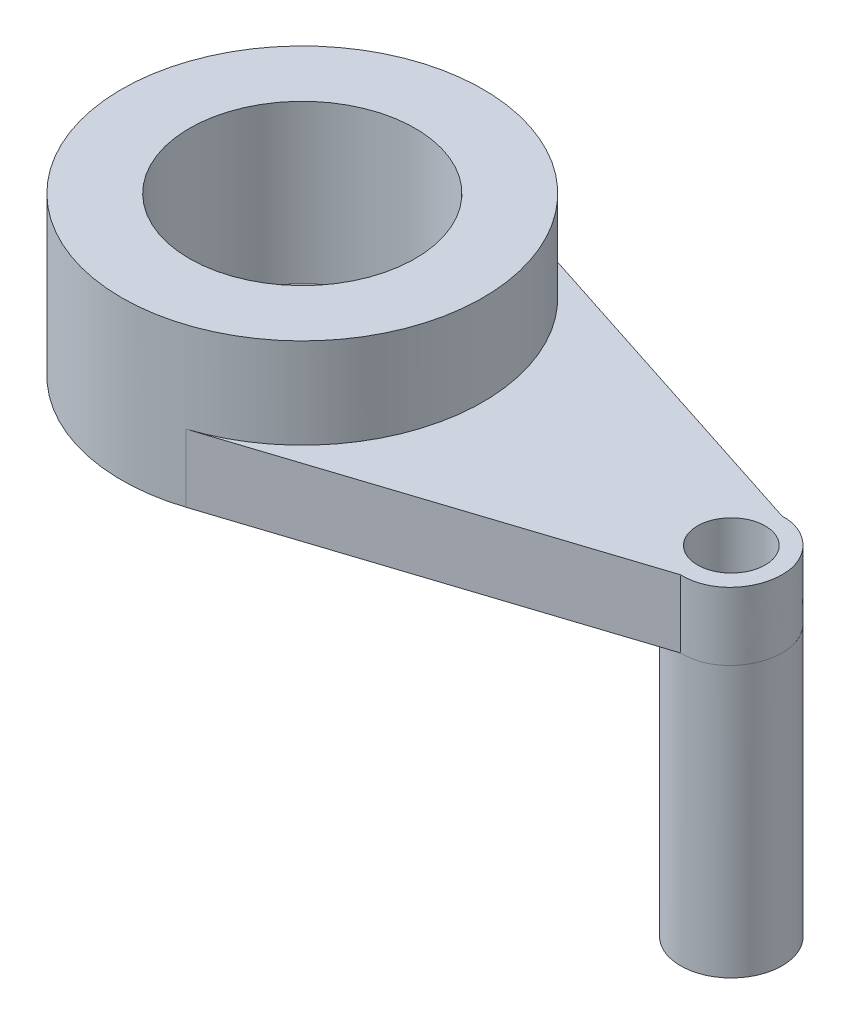
ISO-10303-21;
HEADER;
FILE_DESCRIPTION(('STEP AP214'),'2;1');
FILE_NAME('part.step','',(''),(''),'','','');
FILE_SCHEMA(('AUTOMOTIVE_DESIGN { 1 0 10303 214 1 1 1 1 }'));
ENDSEC;
DATA;
#1=APPLICATION_CONTEXT('core data for automotive mechanical design processes');
#2=APPLICATION_PROTOCOL_DEFINITION('international standard','automotive_design',2000,#1);
#3=PRODUCT_CONTEXT('',#1,'mechanical');
#4=PRODUCT('Part','Part','',(#3));
#5=PRODUCT_RELATED_PRODUCT_CATEGORY('part','',(#4));
#6=PRODUCT_DEFINITION_FORMATION('','',#4);
#7=PRODUCT_DEFINITION_CONTEXT('part definition',#1,'design');
#8=PRODUCT_DEFINITION('design','',#6,#7);
#9=PRODUCT_DEFINITION_SHAPE('','',#8);
#10=(LENGTH_UNIT() NAMED_UNIT(*) SI_UNIT(.MILLI.,.METRE.));
#11=(NAMED_UNIT(*) PLANE_ANGLE_UNIT() SI_UNIT($,.RADIAN.));
#12=(NAMED_UNIT(*) SI_UNIT($,.STERADIAN.) SOLID_ANGLE_UNIT());
#13=UNCERTAINTY_MEASURE_WITH_UNIT(LENGTH_MEASURE(1.E-05),#10,'distance_accuracy_value','');
#14=(GEOMETRIC_REPRESENTATION_CONTEXT(3) GLOBAL_UNCERTAINTY_ASSIGNED_CONTEXT((#13)) GLOBAL_UNIT_ASSIGNED_CONTEXT((#10,
#11,#12)) REPRESENTATION_CONTEXT('',''));
#15=CARTESIAN_POINT('',(0.,0.,0.));
#16=DIRECTION('',(0.,0.,1.));
#17=DIRECTION('',(1.,0.,0.));
#18=AXIS2_PLACEMENT_3D('',#15,#16,#17);
#19=CARTESIAN_POINT('',(0.,0.,0.));
#20=DIRECTION('',(0.,1.,0.));
#21=DIRECTION('',(0.,0.,1.));
#22=AXIS2_PLACEMENT_3D('',#19,#20,#21);
#23=PLANE('',#22);
#24=CARTESIAN_POINT('',(38.,0.,0.));
#25=DIRECTION('',(0.,-1.,0.));
#26=DIRECTION('',(0.,0.,-1.));
#27=AXIS2_PLACEMENT_3D('',#24,#25,#26);
#28=CIRCLE('',#27,4.5);
#29=CARTESIAN_POINT('',(38.,0.,-4.5));
#30=VERTEX_POINT('',#29);
#31=CARTESIAN_POINT('',(40.5306412660929,0.,-3.72100185196088));
#32=VERTEX_POINT('',#31);
#33=EDGE_CURVE('E131',#30,#32,#28,.T.);
#34=ORIENTED_EDGE('',*,*,#33,.F.);
#35=CARTESIAN_POINT('',(38.,0.,-4.5));
#36=CARTESIAN_POINT('',(39.9750172906775,0.,-4.58680046096028));
#37=CARTESIAN_POINT('',(44.3325526531745,0.,-0.991088108861047));
#38=CARTESIAN_POINT('',(41.3034746378759,0.,4.58590864514612));
#39=CARTESIAN_POINT('',(38.,0.,4.5));
#40=B_SPLINE_CURVE_WITH_KNOTS('',3,(#35,#36,#37,#38,#39),.UNSPECIFIED.,.F.,.F.,(4,1,4),(0.,
0.419490448029147,1.),.UNSPECIFIED.);
#41=EDGE_CURVE('E112',#30,#32,#40,.T.);
#42=ORIENTED_EDGE('',*,*,#41,.T.);
#43=EDGE_LOOP('',(#34,#42));
#44=FACE_BOUND('',#43,.T.);
#45=ADVANCED_FACE('F43',(#44),#23,.F.);
#46=CARTESIAN_POINT('',(42.2220444290614,0.,1.55702949202364));
#47=VERTEX_POINT('',#46);
#48=CARTESIAN_POINT('',(38.,0.,4.5));
#49=VERTEX_POINT('',#48);
#50=EDGE_CURVE('E53',#47,#49,#28,.T.);
#51=ORIENTED_EDGE('',*,*,#50,.F.);
#52=EDGE_CURVE('E47',#47,#49,#40,.T.);
#53=ORIENTED_EDGE('',*,*,#52,.T.);
#54=EDGE_LOOP('',(#51,#53));
#55=FACE_BOUND('',#54,.T.);
#56=ADVANCED_FACE('F243',(#55),#23,.F.);
#57=CARTESIAN_POINT('',(0.,14.,0.));
#58=DIRECTION('',(0.,-1.,0.));
#59=DIRECTION('',(0.,0.,-1.));
#60=AXIS2_PLACEMENT_3D('',#57,#58,#59);
#61=CYLINDRICAL_SURFACE('',#60,16.);
#62=CARTESIAN_POINT('',(0.,14.,0.));
#63=DIRECTION('',(0.,1.,0.));
#64=DIRECTION('',(0.,0.,1.));
#65=AXIS2_PLACEMENT_3D('',#62,#63,#64);
#66=CIRCLE('',#65,16.);
#67=CARTESIAN_POINT('',(0.,14.,16.));
#68=VERTEX_POINT('',#67);
#69=EDGE_CURVE('E137',#68,#68,#66,.T.);
#70=ORIENTED_EDGE('',*,*,#69,.F.);
#71=EDGE_LOOP('',(#70));
#72=FACE_BOUND('',#71,.T.);
#73=DIRECTION('',(0.,-1.,0.));
#74=VECTOR('',#73,1.);
#75=CARTESIAN_POINT('',(4.93446328914366,6.,15.2200877805647));
#76=LINE('',#75,#74);
#77=CARTESIAN_POINT('',(4.93446328914366,6.,15.2200877805647));
#78=VERTEX_POINT('',#77);
#79=CARTESIAN_POINT('',(4.93446328914366,0.,15.2200877805647));
#80=VERTEX_POINT('',#79);
#81=EDGE_CURVE('E221',#78,#80,#76,.T.);
#82=ORIENTED_EDGE('',*,*,#81,.F.);
#83=CARTESIAN_POINT('',(0.,6.,0.));
#84=DIRECTION('',(0.,1.,0.));
#85=DIRECTION('',(0.,0.,-1.));
#86=AXIS2_PLACEMENT_3D('',#83,#84,#85);
#87=CIRCLE('',#86,16.);
#88=CARTESIAN_POINT('',(4.93446328914366,6.,-15.2200877805647));
#89=VERTEX_POINT('',#88);
#90=EDGE_CURVE('E216',#78,#89,#87,.T.);
#91=ORIENTED_EDGE('',*,*,#90,.T.);
#92=DIRECTION('',(0.,-1.,0.));
#93=VECTOR('',#92,1.);
#94=CARTESIAN_POINT('',(4.93446328914366,6.,-15.2200877805647));
#95=LINE('',#94,#93);
#96=CARTESIAN_POINT('',(4.93446328914366,0.,-15.2200877805647));
#97=VERTEX_POINT('',#96);
#98=EDGE_CURVE('E128',#89,#97,#95,.T.);
#99=ORIENTED_EDGE('',*,*,#98,.T.);
#100=CARTESIAN_POINT('',(0.,0.,0.));
#101=DIRECTION('',(0.,1.,0.));
#102=DIRECTION('',(0.,0.,1.));
#103=AXIS2_PLACEMENT_3D('',#100,#101,#102);
#104=CIRCLE('',#103,16.);
#105=EDGE_CURVE('E104',#97,#80,#104,.T.);
#106=ORIENTED_EDGE('',*,*,#105,.T.);
#107=EDGE_LOOP('',(#82,#91,#99,#106));
#108=FACE_BOUND('',#107,.T.);
#109=ADVANCED_FACE('F45',(#72,#108),#61,.T.);
#110=CARTESIAN_POINT('',(0.,14.,0.));
#111=DIRECTION('',(0.,1.,0.));
#112=DIRECTION('',(0.,0.,1.));
#113=AXIS2_PLACEMENT_3D('',#110,#111,#112);
#114=PLANE('',#113);
#115=ORIENTED_EDGE('',*,*,#69,.T.);
#116=EDGE_LOOP('',(#115));
#117=FACE_BOUND('',#116,.T.);
#118=CARTESIAN_POINT('',(0.,14.,0.));
#119=DIRECTION('',(0.,1.,0.));
#120=DIRECTION('',(0.,0.,1.));
#121=AXIS2_PLACEMENT_3D('',#118,#119,#120);
#122=CIRCLE('',#121,10.);
#123=CARTESIAN_POINT('',(0.,14.,10.));
#124=VERTEX_POINT('',#123);
#125=EDGE_CURVE('E227',#124,#124,#122,.T.);
#126=ORIENTED_EDGE('',*,*,#125,.F.);
#127=EDGE_LOOP('',(#126));
#128=FACE_BOUND('',#127,.T.);
#129=ADVANCED_FACE('F242',(#117,#128),#114,.T.);
#130=EDGE_CURVE('E103',#49,#30,#28,.T.);
#131=ORIENTED_EDGE('',*,*,#130,.F.);
#132=DIRECTION('',(-0.951255486285291,0.,0.308403955571479));
#133=VECTOR('',#132,1.);
#134=CARTESIAN_POINT('',(4.93446328914366,0.,15.2200877805647));
#135=LINE('',#134,#133);
#136=EDGE_CURVE('E122',#49,#80,#135,.T.);
#137=ORIENTED_EDGE('',*,*,#136,.T.);
#138=ORIENTED_EDGE('',*,*,#105,.F.);
#139=DIRECTION('',(0.951255486285291,0.,0.308403955571479));
#140=VECTOR('',#139,1.);
#141=CARTESIAN_POINT('',(4.93446328914366,0.,-15.2200877805647));
#142=LINE('',#141,#140);
#143=EDGE_CURVE('E97',#97,#30,#142,.T.);
#144=ORIENTED_EDGE('',*,*,#143,.T.);
#145=EDGE_LOOP('',(#131,#137,#138,#144));
#146=FACE_BOUND('',#145,.T.);
#147=CARTESIAN_POINT('',(0.,0.,0.));
#148=DIRECTION('',(0.,1.,0.));
#149=DIRECTION('',(0.,0.,1.));
#150=AXIS2_PLACEMENT_3D('',#147,#148,#149);
#151=CIRCLE('',#150,10.);
#152=CARTESIAN_POINT('',(0.,0.,10.));
#153=VERTEX_POINT('',#152);
#154=EDGE_CURVE('E224',#153,#153,#151,.T.);
#155=ORIENTED_EDGE('',*,*,#154,.T.);
#156=EDGE_LOOP('',(#155));
#157=FACE_BOUND('',#156,.T.);
#158=ADVANCED_FACE('F99',(#146,#157),#23,.F.);
#159=CARTESIAN_POINT('',(0.,14.,0.));
#160=DIRECTION('',(0.,-1.,0.));
#161=DIRECTION('',(0.,0.,-1.));
#162=AXIS2_PLACEMENT_3D('',#159,#160,#161);
#163=CYLINDRICAL_SURFACE('',#162,10.);
#164=ORIENTED_EDGE('',*,*,#125,.T.);
#165=EDGE_LOOP('',(#164));
#166=FACE_BOUND('',#165,.T.);
#167=ORIENTED_EDGE('',*,*,#154,.F.);
#168=EDGE_LOOP('',(#167));
#169=FACE_BOUND('',#168,.T.);
#170=ADVANCED_FACE('F233',(#166,#169),#163,.F.);
#171=CARTESIAN_POINT('',(4.93446328914366,6.,15.2200877805647));
#172=DIRECTION('',(0.308403955571479,0.,0.951255486285291));
#173=DIRECTION('',(0.951255486285291,0.,-0.308403955571479));
#174=AXIS2_PLACEMENT_3D('',#171,#172,#173);
#175=PLANE('',#174);
#176=ORIENTED_EDGE('',*,*,#136,.F.);
#177=DIRECTION('',(0.,-1.,0.));
#178=VECTOR('',#177,1.);
#179=CARTESIAN_POINT('',(38.,6.,4.5));
#180=LINE('',#179,#178);
#181=CARTESIAN_POINT('',(38.,6.,4.5));
#182=VERTEX_POINT('',#181);
#183=EDGE_CURVE('E127',#182,#49,#180,.T.);
#184=ORIENTED_EDGE('',*,*,#183,.F.);
#185=DIRECTION('',(-0.951255486285291,0.,0.308403955571479));
#186=VECTOR('',#185,1.);
#187=CARTESIAN_POINT('',(4.93446328914366,6.,15.2200877805647));
#188=LINE('',#187,#186);
#189=EDGE_CURVE('E173',#182,#78,#188,.T.);
#190=ORIENTED_EDGE('',*,*,#189,.T.);
#191=ORIENTED_EDGE('',*,*,#81,.T.);
#192=EDGE_LOOP('',(#176,#184,#190,#191));
#193=FACE_BOUND('',#192,.T.);
#194=ADVANCED_FACE('F163',(#193),#175,.T.);
#195=CARTESIAN_POINT('',(38.,6.,-4.5));
#196=CARTESIAN_POINT('',(39.9750172906775,6.,-4.58680046096028));
#197=CARTESIAN_POINT('',(44.3325526531745,6.,-0.991088108861047));
#198=CARTESIAN_POINT('',(41.3034746378759,6.,4.58590864514612));
#199=CARTESIAN_POINT('',(38.,6.,4.5));
#200=B_SPLINE_CURVE_WITH_KNOTS('',3,(#195,#196,#197,#198,#199),.UNSPECIFIED.,.F.,.F.,(4,1,4),
(0.,0.419490448029147,1.),.UNSPECIFIED.);
#201=DIRECTION('',(0.,-1.,0.));
#202=VECTOR('',#201,1.);
#203=SURFACE_OF_LINEAR_EXTRUSION('',#200,#202);
#204=ORIENTED_EDGE('',*,*,#41,.F.);
#205=DIRECTION('',(0.,-1.,0.));
#206=VECTOR('',#205,1.);
#207=CARTESIAN_POINT('',(38.,6.,-4.5));
#208=LINE('',#207,#206);
#209=CARTESIAN_POINT('',(38.,6.,-4.5));
#210=VERTEX_POINT('',#209);
#211=EDGE_CURVE('E115',#210,#30,#208,.T.);
#212=ORIENTED_EDGE('',*,*,#211,.F.);
#213=EDGE_CURVE('E167',#210,#182,#200,.T.);
#214=ORIENTED_EDGE('',*,*,#213,.T.);
#215=ORIENTED_EDGE('',*,*,#183,.T.);
#216=ORIENTED_EDGE('',*,*,#52,.F.);
#217=CARTESIAN_POINT('',(42.2220444290614,0.,1.55702949202367));
#218=CARTESIAN_POINT('',(42.5078575603366,0.,0.747496802399015));
#219=CARTESIAN_POINT('',(42.5756917583079,0.,-0.136001013607875));
#220=CARTESIAN_POINT('',(42.3952376726057,0.,-0.965342323379448));
#221=B_SPLINE_CURVE_WITH_KNOTS('',3,(#217,#218,#219,#220),.UNSPECIFIED.,.F.,.F.,(4,4),
(0.438619282067187,0.623115114726937),.UNSPECIFIED.);
#222=CARTESIAN_POINT('',(42.3952376726057,0.,-0.965342323379541));
#223=VERTEX_POINT('',#222);
#224=EDGE_CURVE('E65',#223,#47,#221,.F.);
#225=ORIENTED_EDGE('',*,*,#224,.F.);
#226=CARTESIAN_POINT('',(42.3952376726057,0.,-0.96534232337945));
#227=CARTESIAN_POINT('',(42.3765278935981,0.,-1.05132980638547));
#228=CARTESIAN_POINT('',(42.3551490437352,0.,-1.13673511309915));
#229=CARTESIAN_POINT('',(42.3310673412436,0.,-1.22141544349691));
#230=B_SPLINE_CURVE_WITH_KNOTS('',3,(#226,#227,#228,#229),.UNSPECIFIED.,.F.,.F.,(4,4),
(0.419490448029147,0.438619282067187),.UNSPECIFIED.);
#231=CARTESIAN_POINT('',(42.3310673412474,0.,-1.22141544348357));
#232=VERTEX_POINT('',#231);
#233=EDGE_CURVE('E11',#232,#223,#230,.F.);
#234=ORIENTED_EDGE('',*,*,#233,.F.);
#235=EDGE_CURVE('E118',#32,#232,#40,.T.);
#236=ORIENTED_EDGE('',*,*,#235,.F.);
#237=EDGE_LOOP('',(#204,#212,#214,#215,#216,#225,#234,#236));
#238=FACE_BOUND('',#237,.T.);
#239=ADVANCED_FACE('F113',(#238),#203,.T.);
#240=CARTESIAN_POINT('',(4.93446328914366,6.,-15.2200877805647));
#241=DIRECTION('',(0.308403955571479,0.,-0.951255486285291));
#242=DIRECTION('',(-0.951255486285291,0.,-0.308403955571479));
#243=AXIS2_PLACEMENT_3D('',#240,#241,#242);
#244=PLANE('',#243);
#245=ORIENTED_EDGE('',*,*,#143,.F.);
#246=ORIENTED_EDGE('',*,*,#98,.F.);
#247=DIRECTION('',(0.951255486285291,0.,0.308403955571479));
#248=VECTOR('',#247,1.);
#249=CARTESIAN_POINT('',(4.93446328914366,6.,-15.2200877805647));
#250=LINE('',#249,#248);
#251=EDGE_CURVE('E126',#89,#210,#250,.T.);
#252=ORIENTED_EDGE('',*,*,#251,.T.);
#253=ORIENTED_EDGE('',*,*,#211,.T.);
#254=EDGE_LOOP('',(#245,#246,#252,#253));
#255=FACE_BOUND('',#254,.T.);
#256=ADVANCED_FACE('F124',(#255),#244,.T.);
#257=CARTESIAN_POINT('',(0.,6.,0.));
#258=DIRECTION('',(0.,-1.,0.));
#259=DIRECTION('',(0.,0.,-1.));
#260=AXIS2_PLACEMENT_3D('',#257,#258,#259);
#261=PLANE('',#260);
#262=CARTESIAN_POINT('',(38.,6.,0.));
#263=DIRECTION('',(0.,1.,0.));
#264=DIRECTION('',(0.,0.,1.));
#265=AXIS2_PLACEMENT_3D('',#262,#263,#264);
#266=CIRCLE('',#265,3.);
#267=CARTESIAN_POINT('',(38.,6.,3.));
#268=VERTEX_POINT('',#267);
#269=EDGE_CURVE('E202',#268,#268,#266,.T.);
#270=ORIENTED_EDGE('',*,*,#269,.F.);
#271=EDGE_LOOP('',(#270));
#272=FACE_BOUND('',#271,.T.);
#273=ORIENTED_EDGE('',*,*,#90,.F.);
#274=ORIENTED_EDGE('',*,*,#189,.F.);
#275=ORIENTED_EDGE('',*,*,#213,.F.);
#276=ORIENTED_EDGE('',*,*,#251,.F.);
#277=EDGE_LOOP('',(#273,#274,#275,#276));
#278=FACE_BOUND('',#277,.T.);
#279=ADVANCED_FACE('F211',(#272,#278),#261,.F.);
#280=CARTESIAN_POINT('',(0.,0.,0.));
#281=DIRECTION('',(0.,-1.,0.));
#282=DIRECTION('',(0.,0.,-1.));
#283=AXIS2_PLACEMENT_3D('',#280,#281,#282);
#284=PLANE('',#283);
#285=EDGE_CURVE('E134',#32,#232,#28,.T.);
#286=ORIENTED_EDGE('',*,*,#285,.F.);
#287=ORIENTED_EDGE('',*,*,#235,.T.);
#288=EDGE_LOOP('',(#286,#287));
#289=FACE_BOUND('',#288,.T.);
#290=ADVANCED_FACE('F199',(#289),#284,.F.);
#291=CARTESIAN_POINT('',(38.,-24.,0.));
#292=DIRECTION('',(0.,1.,0.));
#293=DIRECTION('',(0.,0.,1.));
#294=AXIS2_PLACEMENT_3D('',#291,#292,#293);
#295=CYLINDRICAL_SURFACE('',#294,4.5);
#296=CARTESIAN_POINT('',(38.,-24.,0.));
#297=DIRECTION('',(0.,-1.,0.));
#298=DIRECTION('',(0.,0.,-1.));
#299=AXIS2_PLACEMENT_3D('',#296,#297,#298);
#300=CIRCLE('',#299,4.5);
#301=CARTESIAN_POINT('',(38.,-24.,-4.5));
#302=VERTEX_POINT('',#301);
#303=EDGE_CURVE('E109',#302,#302,#300,.T.);
#304=ORIENTED_EDGE('',*,*,#303,.F.);
#305=EDGE_LOOP('',(#304));
#306=FACE_BOUND('',#305,.T.);
#307=ORIENTED_EDGE('',*,*,#33,.T.);
#308=ORIENTED_EDGE('',*,*,#285,.T.);
#309=ORIENTED_EDGE('',*,*,#233,.T.);
#310=ORIENTED_EDGE('',*,*,#224,.T.);
#311=ORIENTED_EDGE('',*,*,#50,.T.);
#312=ORIENTED_EDGE('',*,*,#130,.T.);
#313=EDGE_LOOP('',(#307,#308,#309,#310,#311,#312));
#314=FACE_BOUND('',#313,.T.);
#315=ADVANCED_FACE('F136',(#306,#314),#295,.T.);
#316=CARTESIAN_POINT('',(0.,-24.,0.));
#317=DIRECTION('',(0.,-1.,0.));
#318=DIRECTION('',(0.,0.,-1.));
#319=AXIS2_PLACEMENT_3D('',#316,#317,#318);
#320=PLANE('',#319);
#321=CARTESIAN_POINT('',(38.,-24.,0.));
#322=DIRECTION('',(0.,1.,0.));
#323=DIRECTION('',(0.,0.,1.));
#324=AXIS2_PLACEMENT_3D('',#321,#322,#323);
#325=CIRCLE('',#324,3.);
#326=CARTESIAN_POINT('',(38.,-24.,3.));
#327=VERTEX_POINT('',#326);
#328=EDGE_CURVE('E200',#327,#327,#325,.T.);
#329=ORIENTED_EDGE('',*,*,#328,.T.);
#330=EDGE_LOOP('',(#329));
#331=FACE_BOUND('',#330,.T.);
#332=ORIENTED_EDGE('',*,*,#303,.T.);
#333=EDGE_LOOP('',(#332));
#334=FACE_BOUND('',#333,.T.);
#335=ADVANCED_FACE('F298',(#331,#334),#320,.T.);
#336=CARTESIAN_POINT('',(38.,-24.,0.));
#337=DIRECTION('',(0.,1.,0.));
#338=DIRECTION('',(0.,0.,1.));
#339=AXIS2_PLACEMENT_3D('',#336,#337,#338);
#340=CYLINDRICAL_SURFACE('',#339,3.);
#341=ORIENTED_EDGE('',*,*,#328,.F.);
#342=EDGE_LOOP('',(#341));
#343=FACE_BOUND('',#342,.T.);
#344=ORIENTED_EDGE('',*,*,#269,.T.);
#345=EDGE_LOOP('',(#344));
#346=FACE_BOUND('',#345,.T.);
#347=ADVANCED_FACE('F209',(#343,#346),#340,.F.);
#348=CLOSED_SHELL('',(#45,#56,#109,#129,#158,#170,#194,#239,#256,#279,#290,#315,#335,#347));
#349=MANIFOLD_SOLID_BREP('B2',#348);
#350=ADVANCED_BREP_SHAPE_REPRESENTATION('',(#18,#349),#14);
#351=SHAPE_DEFINITION_REPRESENTATION(#9,#350);
ENDSEC;
END-ISO-10303-21;
